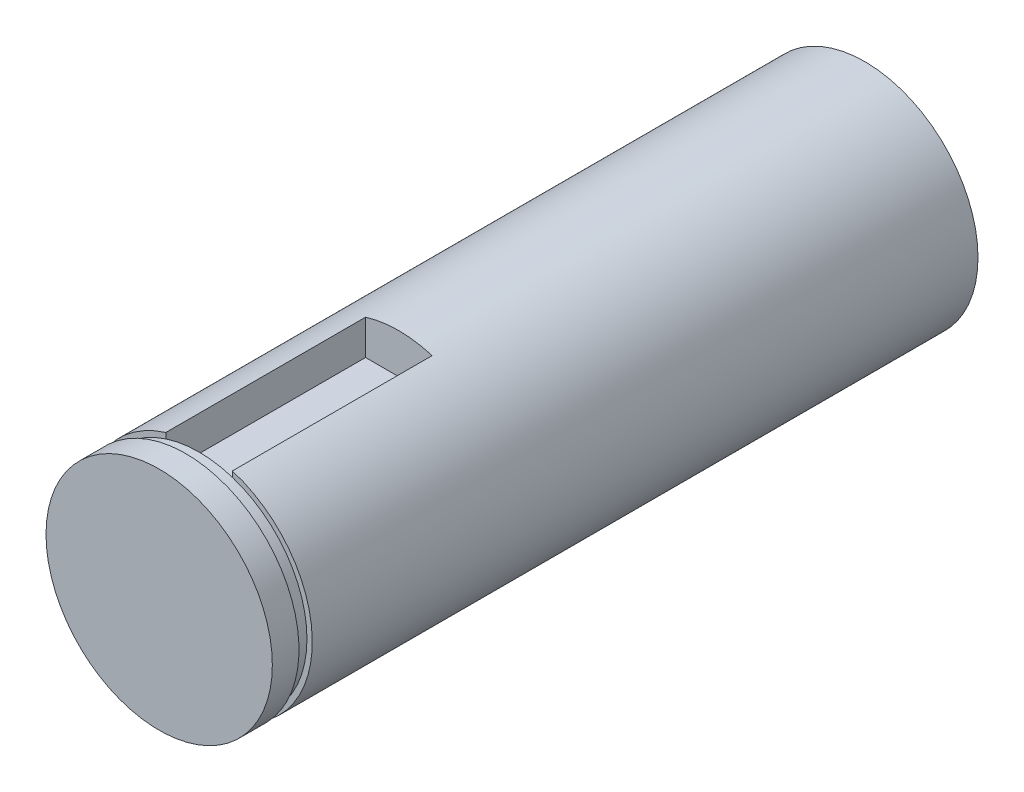
ISO-10303-21;
HEADER;
FILE_DESCRIPTION(('STEP AP214'),'2;1');
FILE_NAME('part.step','',(''),(''),'','','');
FILE_SCHEMA(('AUTOMOTIVE_DESIGN { 1 0 10303 214 1 1 1 1 }'));
ENDSEC;
DATA;
#1=APPLICATION_CONTEXT('core data for automotive mechanical design processes');
#2=APPLICATION_PROTOCOL_DEFINITION('international standard','automotive_design',2000,#1);
#3=PRODUCT_CONTEXT('',#1,'mechanical');
#4=PRODUCT('Part','Part','',(#3));
#5=PRODUCT_RELATED_PRODUCT_CATEGORY('part','',(#4));
#6=PRODUCT_DEFINITION_FORMATION('','',#4);
#7=PRODUCT_DEFINITION_CONTEXT('part definition',#1,'design');
#8=PRODUCT_DEFINITION('design','',#6,#7);
#9=PRODUCT_DEFINITION_SHAPE('','',#8);
#10=(LENGTH_UNIT() NAMED_UNIT(*) SI_UNIT(.MILLI.,.METRE.));
#11=(NAMED_UNIT(*) PLANE_ANGLE_UNIT() SI_UNIT($,.RADIAN.));
#12=(NAMED_UNIT(*) SI_UNIT($,.STERADIAN.) SOLID_ANGLE_UNIT());
#13=UNCERTAINTY_MEASURE_WITH_UNIT(LENGTH_MEASURE(1.E-05),#10,'distance_accuracy_value','');
#14=(GEOMETRIC_REPRESENTATION_CONTEXT(3) GLOBAL_UNCERTAINTY_ASSIGNED_CONTEXT((#13)) GLOBAL_UNIT_ASSIGNED_CONTEXT((#10,
#11,#12)) REPRESENTATION_CONTEXT('',''));
#15=CARTESIAN_POINT('',(0.,0.,0.));
#16=DIRECTION('',(0.,0.,1.));
#17=DIRECTION('',(1.,0.,0.));
#18=AXIS2_PLACEMENT_3D('',#15,#16,#17);
#19=CARTESIAN_POINT('',(0.,0.,50.));
#20=DIRECTION('',(0.,0.,-1.));
#21=DIRECTION('',(-1.,0.,0.));
#22=AXIS2_PLACEMENT_3D('',#19,#20,#21);
#23=CYLINDRICAL_SURFACE('',#22,8.5);
#24=CARTESIAN_POINT('',(0.,0.,53.));
#25=DIRECTION('',(0.,0.,1.));
#26=DIRECTION('',(1.,0.,0.));
#27=AXIS2_PLACEMENT_3D('',#24,#25,#26);
#28=CIRCLE('',#27,8.5);
#29=CARTESIAN_POINT('',(8.5,0.,53.));
#30=VERTEX_POINT('',#29);
#31=EDGE_CURVE('E150',#30,#30,#28,.T.);
#32=ORIENTED_EDGE('',*,*,#31,.F.);
#33=EDGE_LOOP('',(#32));
#34=FACE_BOUND('',#33,.T.);
#35=CARTESIAN_POINT('',(0.,0.,51.));
#36=DIRECTION('',(0.,0.,-1.));
#37=DIRECTION('',(-1.,0.,0.));
#38=AXIS2_PLACEMENT_3D('',#35,#36,#37);
#39=CIRCLE('',#38,8.5);
#40=CARTESIAN_POINT('',(-8.5,0.,51.));
#41=VERTEX_POINT('',#40);
#42=EDGE_CURVE('E54',#41,#41,#39,.T.);
#43=ORIENTED_EDGE('',*,*,#42,.F.);
#44=EDGE_LOOP('',(#43));
#45=FACE_BOUND('',#44,.T.);
#46=ADVANCED_FACE('F50',(#34,#45),#23,.T.);
#47=CARTESIAN_POINT('',(0.,0.,53.));
#48=DIRECTION('',(0.,0.,1.));
#49=DIRECTION('',(1.,0.,0.));
#50=AXIS2_PLACEMENT_3D('',#47,#48,#49);
#51=PLANE('',#50);
#52=ORIENTED_EDGE('',*,*,#31,.T.);
#53=EDGE_LOOP('',(#52));
#54=FACE_BOUND('',#53,.T.);
#55=ADVANCED_FACE('F173',(#54),#51,.T.);
#56=CARTESIAN_POINT('',(0.,0.,51.));
#57=DIRECTION('',(0.,0.,-1.));
#58=DIRECTION('',(-1.,0.,0.));
#59=AXIS2_PLACEMENT_3D('',#56,#57,#58);
#60=PLANE('',#59);
#61=CARTESIAN_POINT('',(0.,0.,51.));
#62=DIRECTION('',(0.,0.,-1.));
#63=DIRECTION('',(-1.,0.,0.));
#64=AXIS2_PLACEMENT_3D('',#61,#62,#63);
#65=CIRCLE('',#64,8.1);
#66=CARTESIAN_POINT('',(-8.1,0.,51.));
#67=VERTEX_POINT('',#66);
#68=EDGE_CURVE('E109',#67,#67,#65,.T.);
#69=ORIENTED_EDGE('',*,*,#68,.F.);
#70=EDGE_LOOP('',(#69));
#71=FACE_BOUND('',#70,.T.);
#72=ORIENTED_EDGE('',*,*,#42,.T.);
#73=EDGE_LOOP('',(#72));
#74=FACE_BOUND('',#73,.T.);
#75=ADVANCED_FACE('F170',(#71,#74),#60,.T.);
#76=CARTESIAN_POINT('',(0.,0.,50.));
#77=DIRECTION('',(0.,0.,-1.));
#78=DIRECTION('',(-1.,0.,0.));
#79=AXIS2_PLACEMENT_3D('',#76,#77,#78);
#80=PLANE('',#79);
#81=CARTESIAN_POINT('',(0.,0.,50.));
#82=DIRECTION('',(0.,0.,-1.));
#83=DIRECTION('',(-1.,0.,0.));
#84=AXIS2_PLACEMENT_3D('',#81,#82,#83);
#85=CIRCLE('',#84,8.5);
#86=CARTESIAN_POINT('',(2.5,8.12403840463596,50.));
#87=VERTEX_POINT('',#86);
#88=CARTESIAN_POINT('',(-2.5,8.12403840463596,50.));
#89=VERTEX_POINT('',#88);
#90=EDGE_CURVE('E162',#87,#89,#85,.T.);
#91=ORIENTED_EDGE('',*,*,#90,.F.);
#92=DIRECTION('',(0.,1.,0.));
#93=VECTOR('',#92,1.);
#94=CARTESIAN_POINT('',(2.5,8.5,50.));
#95=LINE('',#94,#93);
#96=CARTESIAN_POINT('',(2.5,7.70454411370329,50.));
#97=VERTEX_POINT('',#96);
#98=EDGE_CURVE('E99',#97,#87,#95,.T.);
#99=ORIENTED_EDGE('',*,*,#98,.F.);
#100=CARTESIAN_POINT('',(0.,0.,50.));
#101=DIRECTION('',(0.,0.,-1.));
#102=DIRECTION('',(-1.,0.,0.));
#103=AXIS2_PLACEMENT_3D('',#100,#101,#102);
#104=CIRCLE('',#103,8.1);
#105=CARTESIAN_POINT('',(-2.5,7.70454411370329,50.));
#106=VERTEX_POINT('',#105);
#107=EDGE_CURVE('E66',#97,#106,#104,.T.);
#108=ORIENTED_EDGE('',*,*,#107,.T.);
#109=DIRECTION('',(0.,-1.,0.));
#110=VECTOR('',#109,1.);
#111=CARTESIAN_POINT('',(-2.5,0.,50.));
#112=LINE('',#111,#110);
#113=EDGE_CURVE('E60',#89,#106,#112,.T.);
#114=ORIENTED_EDGE('',*,*,#113,.F.);
#115=EDGE_LOOP('',(#91,#99,#108,#114));
#116=FACE_BOUND('',#115,.T.);
#117=ADVANCED_FACE('F95',(#116),#80,.F.);
#118=CARTESIAN_POINT('',(0.,0.,51.));
#119=DIRECTION('',(0.,0.,-1.));
#120=DIRECTION('',(-1.,0.,0.));
#121=AXIS2_PLACEMENT_3D('',#118,#119,#120);
#122=CYLINDRICAL_SURFACE('',#121,8.1);
#123=ORIENTED_EDGE('',*,*,#68,.T.);
#124=EDGE_LOOP('',(#123));
#125=FACE_BOUND('',#124,.T.);
#126=EDGE_CURVE('E102',#106,#97,#104,.T.);
#127=ORIENTED_EDGE('',*,*,#126,.F.);
#128=ORIENTED_EDGE('',*,*,#107,.F.);
#129=EDGE_LOOP('',(#127,#128));
#130=FACE_BOUND('',#129,.T.);
#131=ADVANCED_FACE('F105',(#125,#130),#122,.T.);
#132=CARTESIAN_POINT('',(0.,0.,0.));
#133=DIRECTION('',(0.,0.,1.));
#134=DIRECTION('',(1.,0.,0.));
#135=AXIS2_PLACEMENT_3D('',#132,#133,#134);
#136=PLANE('',#135);
#137=CARTESIAN_POINT('',(0.,0.,0.));
#138=DIRECTION('',(0.,0.,1.));
#139=DIRECTION('',(1.,0.,0.));
#140=AXIS2_PLACEMENT_3D('',#137,#138,#139);
#141=CIRCLE('',#140,8.5);
#142=CARTESIAN_POINT('',(8.5,0.,0.));
#143=VERTEX_POINT('',#142);
#144=EDGE_CURVE('E119',#143,#143,#141,.T.);
#145=ORIENTED_EDGE('',*,*,#144,.F.);
#146=EDGE_LOOP('',(#145));
#147=FACE_BOUND('',#146,.T.);
#148=ADVANCED_FACE('F198',(#147),#136,.F.);
#149=CARTESIAN_POINT('',(0.,0.,35.));
#150=DIRECTION('',(0.,0.,1.));
#151=DIRECTION('',(1.,0.,0.));
#152=AXIS2_PLACEMENT_3D('',#149,#150,#151);
#153=PLANE('',#152);
#154=DIRECTION('',(0.,1.,0.));
#155=VECTOR('',#154,1.);
#156=CARTESIAN_POINT('',(2.5,8.5,35.));
#157=LINE('',#156,#155);
#158=CARTESIAN_POINT('',(2.5,5.5,35.));
#159=VERTEX_POINT('',#158);
#160=CARTESIAN_POINT('',(2.5,8.12403840463596,35.));
#161=VERTEX_POINT('',#160);
#162=EDGE_CURVE('E141',#159,#161,#157,.T.);
#163=ORIENTED_EDGE('',*,*,#162,.T.);
#164=CARTESIAN_POINT('',(0.,0.,35.));
#165=DIRECTION('',(0.,0.,1.));
#166=DIRECTION('',(1.,0.,0.));
#167=AXIS2_PLACEMENT_3D('',#164,#165,#166);
#168=CIRCLE('',#167,8.5);
#169=CARTESIAN_POINT('',(-2.5,8.12403840463596,35.));
#170=VERTEX_POINT('',#169);
#171=EDGE_CURVE('E11',#161,#170,#168,.T.);
#172=ORIENTED_EDGE('',*,*,#171,.T.);
#173=DIRECTION('',(0.,-1.,0.));
#174=VECTOR('',#173,1.);
#175=CARTESIAN_POINT('',(-2.5,8.5,35.));
#176=LINE('',#175,#174);
#177=CARTESIAN_POINT('',(-2.5,5.5,35.));
#178=VERTEX_POINT('',#177);
#179=EDGE_CURVE('E147',#170,#178,#176,.T.);
#180=ORIENTED_EDGE('',*,*,#179,.T.);
#181=DIRECTION('',(1.,0.,0.));
#182=VECTOR('',#181,1.);
#183=CARTESIAN_POINT('',(-2.5,5.5,35.));
#184=LINE('',#183,#182);
#185=EDGE_CURVE('E153',#178,#159,#184,.T.);
#186=ORIENTED_EDGE('',*,*,#185,.T.);
#187=EDGE_LOOP('',(#163,#172,#180,#186));
#188=FACE_BOUND('',#187,.T.);
#189=ADVANCED_FACE('F200',(#188),#153,.T.);
#190=CARTESIAN_POINT('',(-2.5,5.5,35.));
#191=DIRECTION('',(0.,-1.,0.));
#192=DIRECTION('',(1.,0.,0.));
#193=AXIS2_PLACEMENT_3D('',#190,#191,#192);
#194=PLANE('',#193);
#195=DIRECTION('',(1.,0.,0.));
#196=VECTOR('',#195,1.);
#197=CARTESIAN_POINT('',(-2.5,5.5,50.));
#198=LINE('',#197,#196);
#199=CARTESIAN_POINT('',(-2.5,5.5,50.));
#200=VERTEX_POINT('',#199);
#201=CARTESIAN_POINT('',(2.5,5.5,50.));
#202=VERTEX_POINT('',#201);
#203=EDGE_CURVE('E114',#200,#202,#198,.T.);
#204=ORIENTED_EDGE('',*,*,#203,.T.);
#205=DIRECTION('',(0.,0.,1.));
#206=VECTOR('',#205,1.);
#207=CARTESIAN_POINT('',(2.5,5.5,35.));
#208=LINE('',#207,#206);
#209=EDGE_CURVE('E138',#159,#202,#208,.T.);
#210=ORIENTED_EDGE('',*,*,#209,.F.);
#211=ORIENTED_EDGE('',*,*,#185,.F.);
#212=DIRECTION('',(0.,0.,1.));
#213=VECTOR('',#212,1.);
#214=CARTESIAN_POINT('',(-2.5,5.5,35.));
#215=LINE('',#214,#213);
#216=EDGE_CURVE('E139',#178,#200,#215,.T.);
#217=ORIENTED_EDGE('',*,*,#216,.T.);
#218=EDGE_LOOP('',(#204,#210,#211,#217));
#219=FACE_BOUND('',#218,.T.);
#220=ADVANCED_FACE('F205',(#219),#194,.F.);
#221=CARTESIAN_POINT('',(0.,0.,50.));
#222=DIRECTION('',(0.,0.,1.));
#223=DIRECTION('',(1.,0.,0.));
#224=AXIS2_PLACEMENT_3D('',#221,#222,#223);
#225=PLANE('',#224);
#226=ORIENTED_EDGE('',*,*,#126,.T.);
#227=EDGE_CURVE('E145',#202,#97,#95,.T.);
#228=ORIENTED_EDGE('',*,*,#227,.F.);
#229=ORIENTED_EDGE('',*,*,#203,.F.);
#230=EDGE_CURVE('E111',#106,#200,#112,.T.);
#231=ORIENTED_EDGE('',*,*,#230,.F.);
#232=EDGE_LOOP('',(#226,#228,#229,#231));
#233=FACE_BOUND('',#232,.T.);
#234=ADVANCED_FACE('F112',(#233),#225,.F.);
#235=CARTESIAN_POINT('',(2.5,8.5,35.));
#236=DIRECTION('',(1.,0.,0.));
#237=DIRECTION('',(0.,1.,0.));
#238=AXIS2_PLACEMENT_3D('',#235,#236,#237);
#239=PLANE('',#238);
#240=ORIENTED_EDGE('',*,*,#162,.F.);
#241=ORIENTED_EDGE('',*,*,#209,.T.);
#242=ORIENTED_EDGE('',*,*,#227,.T.);
#243=ORIENTED_EDGE('',*,*,#98,.T.);
#244=DIRECTION('',(0.,0.,-1.));
#245=VECTOR('',#244,1.);
#246=CARTESIAN_POINT('',(2.5,8.12403840463596,50.));
#247=LINE('',#246,#245);
#248=EDGE_CURVE('E134',#161,#87,#247,.F.);
#249=ORIENTED_EDGE('',*,*,#248,.F.);
#250=EDGE_LOOP('',(#240,#241,#242,#243,#249));
#251=FACE_BOUND('',#250,.T.);
#252=ADVANCED_FACE('F192',(#251),#239,.F.);
#253=CARTESIAN_POINT('',(-2.5,8.5,35.));
#254=DIRECTION('',(-1.,0.,0.));
#255=DIRECTION('',(0.,-1.,0.));
#256=AXIS2_PLACEMENT_3D('',#253,#254,#255);
#257=PLANE('',#256);
#258=ORIENTED_EDGE('',*,*,#113,.T.);
#259=ORIENTED_EDGE('',*,*,#230,.T.);
#260=ORIENTED_EDGE('',*,*,#216,.F.);
#261=ORIENTED_EDGE('',*,*,#179,.F.);
#262=DIRECTION('',(0.,0.,-1.));
#263=VECTOR('',#262,1.);
#264=CARTESIAN_POINT('',(-2.5,8.12403840463596,50.));
#265=LINE('',#264,#263);
#266=EDGE_CURVE('E124',#89,#170,#265,.T.);
#267=ORIENTED_EDGE('',*,*,#266,.F.);
#268=EDGE_LOOP('',(#258,#259,#260,#261,#267));
#269=FACE_BOUND('',#268,.T.);
#270=ADVANCED_FACE('F122',(#269),#257,.F.);
#271=ORIENTED_EDGE('',*,*,#248,.T.);
#272=ORIENTED_EDGE('',*,*,#90,.T.);
#273=ORIENTED_EDGE('',*,*,#266,.T.);
#274=ORIENTED_EDGE('',*,*,#171,.F.);
#275=EDGE_LOOP('',(#271,#272,#273,#274));
#276=FACE_BOUND('',#275,.T.);
#277=ORIENTED_EDGE('',*,*,#144,.T.);
#278=EDGE_LOOP('',(#277));
#279=FACE_BOUND('',#278,.T.);
#280=ADVANCED_FACE('F52',(#276,#279),#23,.T.);
#281=CLOSED_SHELL('',(#46,#55,#75,#117,#131,#148,#189,#220,#234,#252,#270,#280));
#282=MANIFOLD_SOLID_BREP('B2',#281);
#283=ADVANCED_BREP_SHAPE_REPRESENTATION('',(#18,#282),#14);
#284=SHAPE_DEFINITION_REPRESENTATION(#9,#283);
ENDSEC;
END-ISO-10303-21;
